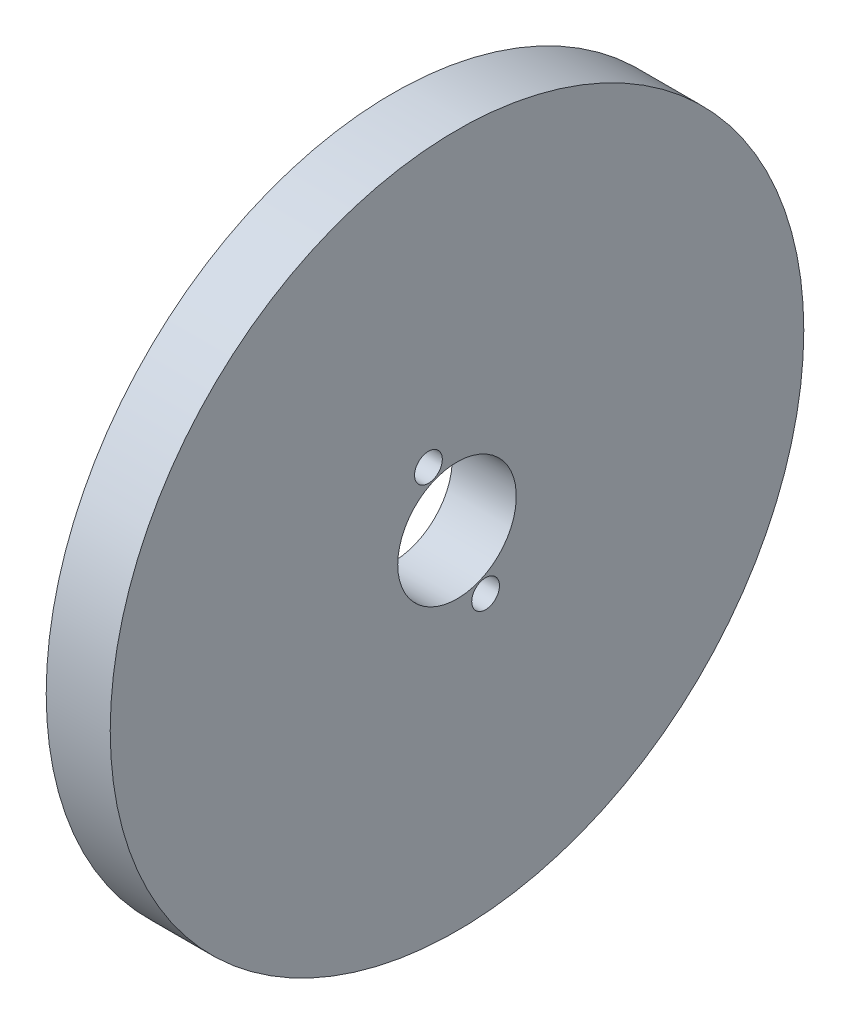
ISO-10303-21;
HEADER;
FILE_DESCRIPTION(('STEP AP214'),'2;1');
FILE_NAME('part.step','',(''),(''),'','','');
FILE_SCHEMA(('AUTOMOTIVE_DESIGN { 1 0 10303 214 1 1 1 1 }'));
ENDSEC;
DATA;
#1=APPLICATION_CONTEXT('core data for automotive mechanical design processes');
#2=APPLICATION_PROTOCOL_DEFINITION('international standard','automotive_design',2000,#1);
#3=PRODUCT_CONTEXT('',#1,'mechanical');
#4=PRODUCT('Part','Part','',(#3));
#5=PRODUCT_RELATED_PRODUCT_CATEGORY('part','',(#4));
#6=PRODUCT_DEFINITION_FORMATION('','',#4);
#7=PRODUCT_DEFINITION_CONTEXT('part definition',#1,'design');
#8=PRODUCT_DEFINITION('design','',#6,#7);
#9=PRODUCT_DEFINITION_SHAPE('','',#8);
#10=(LENGTH_UNIT() NAMED_UNIT(*) SI_UNIT(.MILLI.,.METRE.));
#11=(NAMED_UNIT(*) PLANE_ANGLE_UNIT() SI_UNIT($,.RADIAN.));
#12=(NAMED_UNIT(*) SI_UNIT($,.STERADIAN.) SOLID_ANGLE_UNIT());
#13=UNCERTAINTY_MEASURE_WITH_UNIT(LENGTH_MEASURE(1.E-05),#10,'distance_accuracy_value','');
#14=(GEOMETRIC_REPRESENTATION_CONTEXT(3) GLOBAL_UNCERTAINTY_ASSIGNED_CONTEXT((#13)) GLOBAL_UNIT_ASSIGNED_CONTEXT((#10,
#11,#12)) REPRESENTATION_CONTEXT('',''));
#15=CARTESIAN_POINT('',(0.,0.,0.));
#16=DIRECTION('',(0.,0.,1.));
#17=DIRECTION('',(1.,0.,0.));
#18=AXIS2_PLACEMENT_3D('',#15,#16,#17);
#19=CARTESIAN_POINT('',(13.7,65.,0.));
#20=DIRECTION('',(1.,0.,0.));
#21=DIRECTION('',(0.,0.,-1.));
#22=AXIS2_PLACEMENT_3D('',#19,#20,#21);
#23=PLANE('',#22);
#24=CARTESIAN_POINT('',(13.7,12.934313455158,5.35756805311126));
#25=DIRECTION('',(1.,0.,0.));
#26=DIRECTION('',(0.,0.,-1.));
#27=AXIS2_PLACEMENT_3D('',#24,#25,#26);
#28=CIRCLE('',#27,2.6);
#29=CARTESIAN_POINT('',(13.7,12.934313455158,7.95756805311126));
#30=VERTEX_POINT('',#29);
#31=EDGE_CURVE('E60',#30,#30,#28,.F.);
#32=ORIENTED_EDGE('',*,*,#31,.F.);
#33=EDGE_LOOP('',(#32));
#34=FACE_BOUND('',#33,.T.);
#35=CARTESIAN_POINT('',(13.7,-12.934313455158,-5.35756805311126));
#36=DIRECTION('',(1.,0.,0.));
#37=DIRECTION('',(0.,0.,-1.));
#38=AXIS2_PLACEMENT_3D('',#35,#36,#37);
#39=CIRCLE('',#38,2.6);
#40=CARTESIAN_POINT('',(13.7,-12.934313455158,-2.75756805311125));
#41=VERTEX_POINT('',#40);
#42=EDGE_CURVE('E64',#41,#41,#39,.F.);
#43=ORIENTED_EDGE('',*,*,#42,.F.);
#44=EDGE_LOOP('',(#43));
#45=FACE_BOUND('',#44,.T.);
#46=CARTESIAN_POINT('',(13.7,0.,0.));
#47=DIRECTION('',(-1.,0.,0.));
#48=DIRECTION('',(0.,0.,1.));
#49=AXIS2_PLACEMENT_3D('',#46,#47,#48);
#50=CIRCLE('',#49,11.1125);
#51=CARTESIAN_POINT('',(13.7,0.,11.1125));
#52=VERTEX_POINT('',#51);
#53=EDGE_CURVE('E10',#52,#52,#50,.T.);
#54=ORIENTED_EDGE('',*,*,#53,.F.);
#55=EDGE_LOOP('',(#54));
#56=FACE_BOUND('',#55,.T.);
#57=CARTESIAN_POINT('',(13.7,0.,0.));
#58=DIRECTION('',(-1.,0.,0.));
#59=DIRECTION('',(0.,0.,1.));
#60=AXIS2_PLACEMENT_3D('',#57,#58,#59);
#61=CIRCLE('',#60,65.);
#62=CARTESIAN_POINT('',(13.7,0.,65.));
#63=VERTEX_POINT('',#62);
#64=EDGE_CURVE('E54',#63,#63,#61,.T.);
#65=ORIENTED_EDGE('',*,*,#64,.T.);
#66=EDGE_LOOP('',(#65));
#67=FACE_BOUND('',#66,.T.);
#68=ADVANCED_FACE('F37',(#34,#45,#56,#67),#23,.F.);
#69=CARTESIAN_POINT('',(-110.,0.,0.));
#70=DIRECTION('',(-1.,0.,0.));
#71=DIRECTION('',(0.,0.,1.));
#72=AXIS2_PLACEMENT_3D('',#69,#70,#71);
#73=CYLINDRICAL_SURFACE('',#72,11.1125);
#74=CARTESIAN_POINT('',(25.7,0.,0.));
#75=DIRECTION('',(-1.,0.,0.));
#76=DIRECTION('',(0.,0.,1.));
#77=AXIS2_PLACEMENT_3D('',#74,#75,#76);
#78=CIRCLE('',#77,11.1125);
#79=CARTESIAN_POINT('',(25.7,0.,11.1125));
#80=VERTEX_POINT('',#79);
#81=EDGE_CURVE('E44',#80,#80,#78,.T.);
#82=ORIENTED_EDGE('',*,*,#81,.F.);
#83=EDGE_LOOP('',(#82));
#84=FACE_BOUND('',#83,.T.);
#85=ORIENTED_EDGE('',*,*,#53,.T.);
#86=EDGE_LOOP('',(#85));
#87=FACE_BOUND('',#86,.T.);
#88=ADVANCED_FACE('F84',(#84,#87),#73,.F.);
#89=CARTESIAN_POINT('',(25.7,11.1125,0.));
#90=DIRECTION('',(-1.,0.,0.));
#91=DIRECTION('',(0.,0.,1.));
#92=AXIS2_PLACEMENT_3D('',#89,#90,#91);
#93=PLANE('',#92);
#94=CARTESIAN_POINT('',(25.7,12.934313455158,5.35756805311126));
#95=DIRECTION('',(1.,0.,0.));
#96=DIRECTION('',(0.,0.,-1.));
#97=AXIS2_PLACEMENT_3D('',#94,#95,#96);
#98=CIRCLE('',#97,2.6);
#99=CARTESIAN_POINT('',(25.7,12.934313455158,7.95756805311126));
#100=VERTEX_POINT('',#99);
#101=EDGE_CURVE('E68',#100,#100,#98,.T.);
#102=ORIENTED_EDGE('',*,*,#101,.F.);
#103=EDGE_LOOP('',(#102));
#104=FACE_BOUND('',#103,.T.);
#105=CARTESIAN_POINT('',(25.7,-12.934313455158,-5.35756805311126));
#106=DIRECTION('',(1.,0.,0.));
#107=DIRECTION('',(0.,0.,-1.));
#108=AXIS2_PLACEMENT_3D('',#105,#106,#107);
#109=CIRCLE('',#108,2.6);
#110=CARTESIAN_POINT('',(25.7,-12.934313455158,-2.75756805311125));
#111=VERTEX_POINT('',#110);
#112=EDGE_CURVE('E69',#111,#111,#109,.T.);
#113=ORIENTED_EDGE('',*,*,#112,.F.);
#114=EDGE_LOOP('',(#113));
#115=FACE_BOUND('',#114,.T.);
#116=CARTESIAN_POINT('',(25.7,0.,0.));
#117=DIRECTION('',(-1.,0.,0.));
#118=DIRECTION('',(0.,0.,1.));
#119=AXIS2_PLACEMENT_3D('',#116,#117,#118);
#120=CIRCLE('',#119,65.);
#121=CARTESIAN_POINT('',(25.7,0.,65.));
#122=VERTEX_POINT('',#121);
#123=EDGE_CURVE('E49',#122,#122,#120,.T.);
#124=ORIENTED_EDGE('',*,*,#123,.F.);
#125=EDGE_LOOP('',(#124));
#126=FACE_BOUND('',#125,.T.);
#127=ORIENTED_EDGE('',*,*,#81,.T.);
#128=EDGE_LOOP('',(#127));
#129=FACE_BOUND('',#128,.T.);
#130=ADVANCED_FACE('F80',(#104,#115,#126,#129),#93,.F.);
#131=CARTESIAN_POINT('',(-110.,0.,0.));
#132=DIRECTION('',(-1.,0.,0.));
#133=DIRECTION('',(0.,0.,1.));
#134=AXIS2_PLACEMENT_3D('',#131,#132,#133);
#135=CYLINDRICAL_SURFACE('',#134,65.);
#136=ORIENTED_EDGE('',*,*,#64,.F.);
#137=EDGE_LOOP('',(#136));
#138=FACE_BOUND('',#137,.T.);
#139=ORIENTED_EDGE('',*,*,#123,.T.);
#140=EDGE_LOOP('',(#139));
#141=FACE_BOUND('',#140,.T.);
#142=ADVANCED_FACE('F83',(#138,#141),#135,.T.);
#143=CARTESIAN_POINT('',(13.7,-12.934313455158,-5.35756805311126));
#144=DIRECTION('',(-1.,0.,0.));
#145=DIRECTION('',(0.,0.,1.));
#146=AXIS2_PLACEMENT_3D('',#143,#144,#145);
#147=CYLINDRICAL_SURFACE('',#146,2.6);
#148=CARTESIAN_POINT('',(25.7,-12.934313455158,-2.75756805311125));
#149=CARTESIAN_POINT('',(25.575,-12.934313455158,-2.75756805311125));
#150=CARTESIAN_POINT('',(25.45,-12.934313455158,-2.75756805311125));
#151=CARTESIAN_POINT('',(25.2,-12.934313455158,-2.75756805311125));
#152=CARTESIAN_POINT('',(25.075,-12.934313455158,-2.75756805311125));
#153=CARTESIAN_POINT('',(24.825,-12.934313455158,-2.75756805311125));
#154=CARTESIAN_POINT('',(24.7,-12.934313455158,-2.75756805311125));
#155=CARTESIAN_POINT('',(24.45,-12.934313455158,-2.75756805311125));
#156=CARTESIAN_POINT('',(24.325,-12.934313455158,-2.75756805311125));
#157=CARTESIAN_POINT('',(24.075,-12.934313455158,-2.75756805311125));
#158=CARTESIAN_POINT('',(23.95,-12.934313455158,-2.75756805311125));
#159=CARTESIAN_POINT('',(23.7,-12.934313455158,-2.75756805311125));
#160=CARTESIAN_POINT('',(23.575,-12.934313455158,-2.75756805311125));
#161=CARTESIAN_POINT('',(23.325,-12.934313455158,-2.75756805311125));
#162=CARTESIAN_POINT('',(23.2,-12.934313455158,-2.75756805311125));
#163=CARTESIAN_POINT('',(22.95,-12.934313455158,-2.75756805311125));
#164=CARTESIAN_POINT('',(22.825,-12.934313455158,-2.75756805311125));
#165=CARTESIAN_POINT('',(22.575,-12.934313455158,-2.75756805311125));
#166=CARTESIAN_POINT('',(22.45,-12.934313455158,-2.75756805311125));
#167=CARTESIAN_POINT('',(22.2,-12.934313455158,-2.75756805311125));
#168=CARTESIAN_POINT('',(22.075,-12.934313455158,-2.75756805311125));
#169=CARTESIAN_POINT('',(21.825,-12.934313455158,-2.75756805311125));
#170=CARTESIAN_POINT('',(21.7,-12.934313455158,-2.75756805311125));
#171=CARTESIAN_POINT('',(21.45,-12.934313455158,-2.75756805311125));
#172=CARTESIAN_POINT('',(21.325,-12.934313455158,-2.75756805311125));
#173=CARTESIAN_POINT('',(21.075,-12.934313455158,-2.75756805311125));
#174=CARTESIAN_POINT('',(20.95,-12.934313455158,-2.75756805311125));
#175=CARTESIAN_POINT('',(20.7,-12.934313455158,-2.75756805311125));
#176=CARTESIAN_POINT('',(20.575,-12.934313455158,-2.75756805311125));
#177=CARTESIAN_POINT('',(20.325,-12.934313455158,-2.75756805311125));
#178=CARTESIAN_POINT('',(20.2,-12.934313455158,-2.75756805311125));
#179=CARTESIAN_POINT('',(19.95,-12.934313455158,-2.75756805311125));
#180=CARTESIAN_POINT('',(19.825,-12.934313455158,-2.75756805311125));
#181=CARTESIAN_POINT('',(19.575,-12.934313455158,-2.75756805311125));
#182=CARTESIAN_POINT('',(19.45,-12.934313455158,-2.75756805311125));
#183=CARTESIAN_POINT('',(19.2,-12.934313455158,-2.75756805311125));
#184=CARTESIAN_POINT('',(19.075,-12.934313455158,-2.75756805311125));
#185=CARTESIAN_POINT('',(18.825,-12.934313455158,-2.75756805311125));
#186=CARTESIAN_POINT('',(18.7,-12.934313455158,-2.75756805311125));
#187=CARTESIAN_POINT('',(18.45,-12.934313455158,-2.75756805311125));
#188=CARTESIAN_POINT('',(18.325,-12.934313455158,-2.75756805311125));
#189=CARTESIAN_POINT('',(18.075,-12.934313455158,-2.75756805311125));
#190=CARTESIAN_POINT('',(17.95,-12.934313455158,-2.75756805311125));
#191=CARTESIAN_POINT('',(17.7,-12.934313455158,-2.75756805311125));
#192=CARTESIAN_POINT('',(17.575,-12.934313455158,-2.75756805311125));
#193=CARTESIAN_POINT('',(17.325,-12.934313455158,-2.75756805311125));
#194=CARTESIAN_POINT('',(17.2,-12.934313455158,-2.75756805311125));
#195=CARTESIAN_POINT('',(16.95,-12.934313455158,-2.75756805311125));
#196=CARTESIAN_POINT('',(16.825,-12.934313455158,-2.75756805311125));
#197=CARTESIAN_POINT('',(16.575,-12.934313455158,-2.75756805311125));
#198=CARTESIAN_POINT('',(16.45,-12.934313455158,-2.75756805311125));
#199=CARTESIAN_POINT('',(16.2,-12.934313455158,-2.75756805311125));
#200=CARTESIAN_POINT('',(16.075,-12.934313455158,-2.75756805311125));
#201=CARTESIAN_POINT('',(15.825,-12.934313455158,-2.75756805311125));
#202=CARTESIAN_POINT('',(15.7,-12.934313455158,-2.75756805311125));
#203=CARTESIAN_POINT('',(15.45,-12.934313455158,-2.75756805311125));
#204=CARTESIAN_POINT('',(15.325,-12.934313455158,-2.75756805311125));
#205=CARTESIAN_POINT('',(15.075,-12.934313455158,-2.75756805311125));
#206=CARTESIAN_POINT('',(14.95,-12.934313455158,-2.75756805311125));
#207=CARTESIAN_POINT('',(14.7,-12.934313455158,-2.75756805311125));
#208=CARTESIAN_POINT('',(14.575,-12.934313455158,-2.75756805311125));
#209=CARTESIAN_POINT('',(14.325,-12.934313455158,-2.75756805311125));
#210=CARTESIAN_POINT('',(14.2,-12.934313455158,-2.75756805311125));
#211=CARTESIAN_POINT('',(13.95,-12.934313455158,-2.75756805311125));
#212=CARTESIAN_POINT('',(13.825,-12.934313455158,-2.75756805311125));
#213=CARTESIAN_POINT('',(13.7,-12.934313455158,-2.75756805311125));
#214=B_SPLINE_CURVE_WITH_KNOTS('',3,(#148,#149,#150,#151,#152,#153,#154,#155,#156,#157,#158,
#159,#160,#161,#162,#163,#164,#165,#166,#167,#168,#169,#170,#171,#172,#173,#174,#175,#176,#177,
#178,#179,#180,#181,#182,#183,#184,#185,#186,#187,#188,#189,#190,#191,#192,#193,#194,#195,#196,
#197,#198,#199,#200,#201,#202,#203,#204,#205,#206,#207,#208,#209,#210,#211,#212,#213),
.UNSPECIFIED.,.F.,.F.,(4,2,2,2,2,2,2,2,2,2,2,2,2,2,2,2,2,2,2,2,2,2,2,2,2,2,2,2,2,2,2,2,4),(0.,
0.375,0.750000000000001,1.125,1.5,1.875,2.25,2.625,3.,3.375,3.75,4.125,4.5,4.875,5.25,
5.62499999999999,5.99999999999999,6.375,6.74999999999999,7.12499999999999,7.49999999999999,
7.87499999999999,8.24999999999999,8.62499999999999,8.99999999999999,9.37499999999999,
9.74999999999999,10.125,10.5,10.875,11.25,11.625,12.),.UNSPECIFIED.);
#215=EDGE_CURVE('BSEAM91',#111,#41,#214,.T.);
#216=ORIENTED_EDGE('',*,*,#112,.T.);
#217=ORIENTED_EDGE('',*,*,#42,.T.);
#218=ORIENTED_EDGE('',*,*,#215,.T.);
#219=ORIENTED_EDGE('',*,*,#215,.F.);
#220=EDGE_LOOP('',(#216,#218,#217,#219));
#221=FACE_BOUND('',#220,.T.);
#222=ADVANCED_FACE('F91',(#221),#147,.F.);
#223=CARTESIAN_POINT('',(13.7,12.934313455158,5.35756805311126));
#224=DIRECTION('',(-1.,0.,0.));
#225=DIRECTION('',(0.,0.,1.));
#226=AXIS2_PLACEMENT_3D('',#223,#224,#225);
#227=CYLINDRICAL_SURFACE('',#226,2.6);
#228=CARTESIAN_POINT('',(25.7,12.934313455158,7.95756805311126));
#229=CARTESIAN_POINT('',(25.575,12.934313455158,7.95756805311126));
#230=CARTESIAN_POINT('',(25.45,12.934313455158,7.95756805311126));
#231=CARTESIAN_POINT('',(25.2,12.934313455158,7.95756805311126));
#232=CARTESIAN_POINT('',(25.075,12.934313455158,7.95756805311126));
#233=CARTESIAN_POINT('',(24.825,12.934313455158,7.95756805311126));
#234=CARTESIAN_POINT('',(24.7,12.934313455158,7.95756805311126));
#235=CARTESIAN_POINT('',(24.45,12.934313455158,7.95756805311126));
#236=CARTESIAN_POINT('',(24.325,12.934313455158,7.95756805311126));
#237=CARTESIAN_POINT('',(24.075,12.934313455158,7.95756805311126));
#238=CARTESIAN_POINT('',(23.95,12.934313455158,7.95756805311126));
#239=CARTESIAN_POINT('',(23.7,12.934313455158,7.95756805311126));
#240=CARTESIAN_POINT('',(23.575,12.934313455158,7.95756805311126));
#241=CARTESIAN_POINT('',(23.325,12.934313455158,7.95756805311126));
#242=CARTESIAN_POINT('',(23.2,12.934313455158,7.95756805311126));
#243=CARTESIAN_POINT('',(22.95,12.934313455158,7.95756805311126));
#244=CARTESIAN_POINT('',(22.825,12.934313455158,7.95756805311126));
#245=CARTESIAN_POINT('',(22.575,12.934313455158,7.95756805311126));
#246=CARTESIAN_POINT('',(22.45,12.934313455158,7.95756805311126));
#247=CARTESIAN_POINT('',(22.2,12.934313455158,7.95756805311126));
#248=CARTESIAN_POINT('',(22.075,12.934313455158,7.95756805311126));
#249=CARTESIAN_POINT('',(21.825,12.934313455158,7.95756805311126));
#250=CARTESIAN_POINT('',(21.7,12.934313455158,7.95756805311126));
#251=CARTESIAN_POINT('',(21.45,12.934313455158,7.95756805311126));
#252=CARTESIAN_POINT('',(21.325,12.934313455158,7.95756805311126));
#253=CARTESIAN_POINT('',(21.075,12.934313455158,7.95756805311126));
#254=CARTESIAN_POINT('',(20.95,12.934313455158,7.95756805311126));
#255=CARTESIAN_POINT('',(20.7,12.934313455158,7.95756805311126));
#256=CARTESIAN_POINT('',(20.575,12.934313455158,7.95756805311126));
#257=CARTESIAN_POINT('',(20.325,12.934313455158,7.95756805311126));
#258=CARTESIAN_POINT('',(20.2,12.934313455158,7.95756805311126));
#259=CARTESIAN_POINT('',(19.95,12.934313455158,7.95756805311126));
#260=CARTESIAN_POINT('',(19.825,12.934313455158,7.95756805311126));
#261=CARTESIAN_POINT('',(19.575,12.934313455158,7.95756805311126));
#262=CARTESIAN_POINT('',(19.45,12.934313455158,7.95756805311126));
#263=CARTESIAN_POINT('',(19.2,12.934313455158,7.95756805311126));
#264=CARTESIAN_POINT('',(19.075,12.934313455158,7.95756805311126));
#265=CARTESIAN_POINT('',(18.825,12.934313455158,7.95756805311126));
#266=CARTESIAN_POINT('',(18.7,12.934313455158,7.95756805311126));
#267=CARTESIAN_POINT('',(18.45,12.934313455158,7.95756805311126));
#268=CARTESIAN_POINT('',(18.325,12.934313455158,7.95756805311126));
#269=CARTESIAN_POINT('',(18.075,12.934313455158,7.95756805311126));
#270=CARTESIAN_POINT('',(17.95,12.934313455158,7.95756805311126));
#271=CARTESIAN_POINT('',(17.7,12.934313455158,7.95756805311126));
#272=CARTESIAN_POINT('',(17.575,12.934313455158,7.95756805311126));
#273=CARTESIAN_POINT('',(17.325,12.934313455158,7.95756805311126));
#274=CARTESIAN_POINT('',(17.2,12.934313455158,7.95756805311126));
#275=CARTESIAN_POINT('',(16.95,12.934313455158,7.95756805311126));
#276=CARTESIAN_POINT('',(16.825,12.934313455158,7.95756805311126));
#277=CARTESIAN_POINT('',(16.575,12.934313455158,7.95756805311126));
#278=CARTESIAN_POINT('',(16.45,12.934313455158,7.95756805311126));
#279=CARTESIAN_POINT('',(16.2,12.934313455158,7.95756805311126));
#280=CARTESIAN_POINT('',(16.075,12.934313455158,7.95756805311126));
#281=CARTESIAN_POINT('',(15.825,12.934313455158,7.95756805311126));
#282=CARTESIAN_POINT('',(15.7,12.934313455158,7.95756805311126));
#283=CARTESIAN_POINT('',(15.45,12.934313455158,7.95756805311126));
#284=CARTESIAN_POINT('',(15.325,12.934313455158,7.95756805311126));
#285=CARTESIAN_POINT('',(15.075,12.934313455158,7.95756805311126));
#286=CARTESIAN_POINT('',(14.95,12.934313455158,7.95756805311126));
#287=CARTESIAN_POINT('',(14.7,12.934313455158,7.95756805311126));
#288=CARTESIAN_POINT('',(14.575,12.934313455158,7.95756805311126));
#289=CARTESIAN_POINT('',(14.325,12.934313455158,7.95756805311126));
#290=CARTESIAN_POINT('',(14.2,12.934313455158,7.95756805311126));
#291=CARTESIAN_POINT('',(13.95,12.934313455158,7.95756805311126));
#292=CARTESIAN_POINT('',(13.825,12.934313455158,7.95756805311126));
#293=CARTESIAN_POINT('',(13.7,12.934313455158,7.95756805311126));
#294=B_SPLINE_CURVE_WITH_KNOTS('',3,(#228,#229,#230,#231,#232,#233,#234,#235,#236,#237,#238,
#239,#240,#241,#242,#243,#244,#245,#246,#247,#248,#249,#250,#251,#252,#253,#254,#255,#256,#257,
#258,#259,#260,#261,#262,#263,#264,#265,#266,#267,#268,#269,#270,#271,#272,#273,#274,#275,#276,
#277,#278,#279,#280,#281,#282,#283,#284,#285,#286,#287,#288,#289,#290,#291,#292,#293),
.UNSPECIFIED.,.F.,.F.,(4,2,2,2,2,2,2,2,2,2,2,2,2,2,2,2,2,2,2,2,2,2,2,2,2,2,2,2,2,2,2,2,4),(0.,
0.375,0.750000000000001,1.125,1.5,1.875,2.25,2.625,3.,3.375,3.75,4.125,4.5,4.875,5.25,
5.62499999999999,5.99999999999999,6.375,6.74999999999999,7.12499999999999,7.49999999999999,
7.87499999999999,8.24999999999999,8.62499999999999,8.99999999999999,9.37499999999999,
9.74999999999999,10.125,10.5,10.875,11.25,11.625,12.),.UNSPECIFIED.);
#295=EDGE_CURVE('BSEAM77',#100,#30,#294,.T.);
#296=ORIENTED_EDGE('',*,*,#101,.T.);
#297=ORIENTED_EDGE('',*,*,#31,.T.);
#298=ORIENTED_EDGE('',*,*,#295,.T.);
#299=ORIENTED_EDGE('',*,*,#295,.F.);
#300=EDGE_LOOP('',(#296,#298,#297,#299));
#301=FACE_BOUND('',#300,.T.);
#302=ADVANCED_FACE('F77',(#301),#227,.F.);
#303=CLOSED_SHELL('',(#68,#88,#130,#142,#222,#302));
#304=MANIFOLD_SOLID_BREP('B2',#303);
#305=ADVANCED_BREP_SHAPE_REPRESENTATION('',(#18,#304),#14);
#306=SHAPE_DEFINITION_REPRESENTATION(#9,#305);
ENDSEC;
END-ISO-10303-21;
